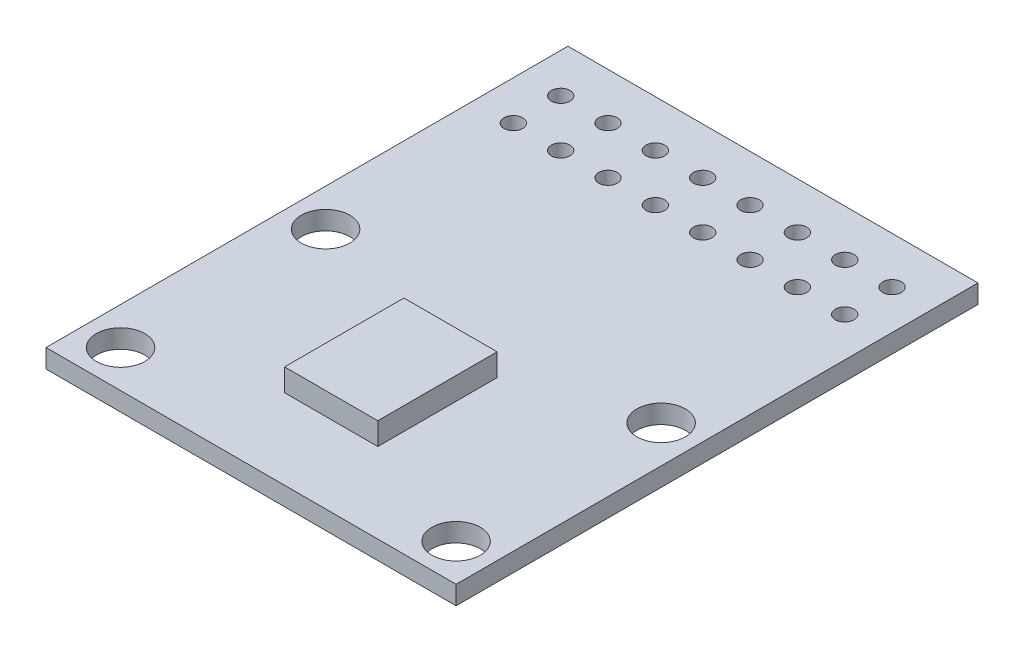
ISO-10303-21;
HEADER;
FILE_DESCRIPTION(('STEP AP214'),'2;1');
FILE_NAME('part.step','',(''),(''),'','','');
FILE_SCHEMA(('AUTOMOTIVE_DESIGN { 1 0 10303 214 1 1 1 1 }'));
ENDSEC;
DATA;
#1=APPLICATION_CONTEXT('core data for automotive mechanical design processes');
#2=APPLICATION_PROTOCOL_DEFINITION('international standard','automotive_design',2000,#1);
#3=PRODUCT_CONTEXT('',#1,'mechanical');
#4=PRODUCT('Part','Part','',(#3));
#5=PRODUCT_RELATED_PRODUCT_CATEGORY('part','',(#4));
#6=PRODUCT_DEFINITION_FORMATION('','',#4);
#7=PRODUCT_DEFINITION_CONTEXT('part definition',#1,'design');
#8=PRODUCT_DEFINITION('design','',#6,#7);
#9=PRODUCT_DEFINITION_SHAPE('','',#8);
#10=(LENGTH_UNIT() NAMED_UNIT(*) SI_UNIT(.MILLI.,.METRE.));
#11=(NAMED_UNIT(*) PLANE_ANGLE_UNIT() SI_UNIT($,.RADIAN.));
#12=(NAMED_UNIT(*) SI_UNIT($,.STERADIAN.) SOLID_ANGLE_UNIT());
#13=UNCERTAINTY_MEASURE_WITH_UNIT(LENGTH_MEASURE(1.E-05),#10,'distance_accuracy_value','');
#14=(GEOMETRIC_REPRESENTATION_CONTEXT(3) GLOBAL_UNCERTAINTY_ASSIGNED_CONTEXT((#13)) GLOBAL_UNIT_ASSIGNED_CONTEXT((#10,
#11,#12)) REPRESENTATION_CONTEXT('',''));
#15=CARTESIAN_POINT('',(0.,0.,0.));
#16=DIRECTION('',(0.,0.,1.));
#17=DIRECTION('',(1.,0.,0.));
#18=AXIS2_PLACEMENT_3D('',#15,#16,#17);
#19=CARTESIAN_POINT('',(0.,1.,0.));
#20=DIRECTION('',(0.,-1.,0.));
#21=DIRECTION('',(0.,0.,-1.));
#22=AXIS2_PLACEMENT_3D('',#19,#20,#21);
#23=PLANE('',#22);
#24=CARTESIAN_POINT('',(-8.89,1.,-18.));
#25=DIRECTION('',(0.,-1.,0.));
#26=DIRECTION('',(0.,0.,-1.));
#27=AXIS2_PLACEMENT_3D('',#24,#25,#26);
#28=CIRCLE('',#27,0.500000000000001);
#29=CARTESIAN_POINT('',(-8.89,1.,-18.5));
#30=VERTEX_POINT('',#29);
#31=EDGE_CURVE('E494',#30,#30,#28,.T.);
#32=ORIENTED_EDGE('',*,*,#31,.T.);
#33=EDGE_LOOP('',(#32));
#34=FACE_BOUND('',#33,.T.);
#35=CARTESIAN_POINT('',(8.89,1.,-18.));
#36=DIRECTION('',(0.,-1.,0.));
#37=DIRECTION('',(0.,0.,-1.));
#38=AXIS2_PLACEMENT_3D('',#35,#36,#37);
#39=CIRCLE('',#38,0.500000000000001);
#40=CARTESIAN_POINT('',(8.89,1.,-18.5));
#41=VERTEX_POINT('',#40);
#42=EDGE_CURVE('E498',#41,#41,#39,.T.);
#43=ORIENTED_EDGE('',*,*,#42,.T.);
#44=EDGE_LOOP('',(#43));
#45=FACE_BOUND('',#44,.T.);
#46=CARTESIAN_POINT('',(6.35,1.,-18.));
#47=DIRECTION('',(0.,-1.,0.));
#48=DIRECTION('',(0.,0.,-1.));
#49=AXIS2_PLACEMENT_3D('',#46,#47,#48);
#50=CIRCLE('',#49,0.500000000000001);
#51=CARTESIAN_POINT('',(6.35,1.,-18.5));
#52=VERTEX_POINT('',#51);
#53=EDGE_CURVE('E507',#52,#52,#50,.T.);
#54=ORIENTED_EDGE('',*,*,#53,.T.);
#55=EDGE_LOOP('',(#54));
#56=FACE_BOUND('',#55,.T.);
#57=CARTESIAN_POINT('',(3.81,1.,-18.));
#58=DIRECTION('',(0.,-1.,0.));
#59=DIRECTION('',(0.,0.,-1.));
#60=AXIS2_PLACEMENT_3D('',#57,#58,#59);
#61=CIRCLE('',#60,0.500000000000001);
#62=CARTESIAN_POINT('',(3.81,1.,-18.5));
#63=VERTEX_POINT('',#62);
#64=EDGE_CURVE('E513',#63,#63,#61,.T.);
#65=ORIENTED_EDGE('',*,*,#64,.T.);
#66=EDGE_LOOP('',(#65));
#67=FACE_BOUND('',#66,.T.);
#68=CARTESIAN_POINT('',(1.27,1.,-18.));
#69=DIRECTION('',(0.,-1.,0.));
#70=DIRECTION('',(0.,0.,-1.));
#71=AXIS2_PLACEMENT_3D('',#68,#69,#70);
#72=CIRCLE('',#71,0.500000000000001);
#73=CARTESIAN_POINT('',(1.27,1.,-18.5));
#74=VERTEX_POINT('',#73);
#75=EDGE_CURVE('E519',#74,#74,#72,.T.);
#76=ORIENTED_EDGE('',*,*,#75,.T.);
#77=EDGE_LOOP('',(#76));
#78=FACE_BOUND('',#77,.T.);
#79=CARTESIAN_POINT('',(-1.27,1.,-18.));
#80=DIRECTION('',(0.,-1.,0.));
#81=DIRECTION('',(0.,0.,-1.));
#82=AXIS2_PLACEMENT_3D('',#79,#80,#81);
#83=CIRCLE('',#82,0.500000000000001);
#84=CARTESIAN_POINT('',(-1.27,1.,-18.5));
#85=VERTEX_POINT('',#84);
#86=EDGE_CURVE('E525',#85,#85,#83,.T.);
#87=ORIENTED_EDGE('',*,*,#86,.T.);
#88=EDGE_LOOP('',(#87));
#89=FACE_BOUND('',#88,.T.);
#90=CARTESIAN_POINT('',(-3.81,1.,-18.));
#91=DIRECTION('',(0.,-1.,0.));
#92=DIRECTION('',(0.,0.,-1.));
#93=AXIS2_PLACEMENT_3D('',#90,#91,#92);
#94=CIRCLE('',#93,0.500000000000002);
#95=CARTESIAN_POINT('',(-3.81,1.,-18.5));
#96=VERTEX_POINT('',#95);
#97=EDGE_CURVE('E531',#96,#96,#94,.T.);
#98=ORIENTED_EDGE('',*,*,#97,.T.);
#99=EDGE_LOOP('',(#98));
#100=FACE_BOUND('',#99,.T.);
#101=CARTESIAN_POINT('',(-6.35,1.,-18.));
#102=DIRECTION('',(0.,-1.,0.));
#103=DIRECTION('',(0.,0.,-1.));
#104=AXIS2_PLACEMENT_3D('',#101,#102,#103);
#105=CIRCLE('',#104,0.500000000000001);
#106=CARTESIAN_POINT('',(-6.35,1.,-18.5));
#107=VERTEX_POINT('',#106);
#108=EDGE_CURVE('E537',#107,#107,#105,.T.);
#109=ORIENTED_EDGE('',*,*,#108,.T.);
#110=EDGE_LOOP('',(#109));
#111=FACE_BOUND('',#110,.T.);
#112=CARTESIAN_POINT('',(8.89000000000001,1.,-15.46));
#113=DIRECTION('',(0.,-1.,0.));
#114=DIRECTION('',(0.,0.,-1.));
#115=AXIS2_PLACEMENT_3D('',#112,#113,#114);
#116=CIRCLE('',#115,0.500000000000001);
#117=CARTESIAN_POINT('',(8.89000000000001,1.,-15.96));
#118=VERTEX_POINT('',#117);
#119=EDGE_CURVE('E543',#118,#118,#116,.T.);
#120=ORIENTED_EDGE('',*,*,#119,.T.);
#121=EDGE_LOOP('',(#120));
#122=FACE_BOUND('',#121,.T.);
#123=CARTESIAN_POINT('',(6.35000000000001,1.,-15.46));
#124=DIRECTION('',(0.,-1.,0.));
#125=DIRECTION('',(0.,0.,-1.));
#126=AXIS2_PLACEMENT_3D('',#123,#124,#125);
#127=CIRCLE('',#126,0.500000000000001);
#128=CARTESIAN_POINT('',(6.35000000000001,1.,-15.96));
#129=VERTEX_POINT('',#128);
#130=EDGE_CURVE('E549',#129,#129,#127,.T.);
#131=ORIENTED_EDGE('',*,*,#130,.T.);
#132=EDGE_LOOP('',(#131));
#133=FACE_BOUND('',#132,.T.);
#134=CARTESIAN_POINT('',(3.81000000000001,1.,-15.46));
#135=DIRECTION('',(0.,-1.,0.));
#136=DIRECTION('',(0.,0.,-1.));
#137=AXIS2_PLACEMENT_3D('',#134,#135,#136);
#138=CIRCLE('',#137,0.500000000000001);
#139=CARTESIAN_POINT('',(3.81000000000001,1.,-15.96));
#140=VERTEX_POINT('',#139);
#141=EDGE_CURVE('E555',#140,#140,#138,.T.);
#142=ORIENTED_EDGE('',*,*,#141,.T.);
#143=EDGE_LOOP('',(#142));
#144=FACE_BOUND('',#143,.T.);
#145=CARTESIAN_POINT('',(1.27000000000001,1.,-15.46));
#146=DIRECTION('',(0.,-1.,0.));
#147=DIRECTION('',(0.,0.,-1.));
#148=AXIS2_PLACEMENT_3D('',#145,#146,#147);
#149=CIRCLE('',#148,0.500000000000001);
#150=CARTESIAN_POINT('',(1.27000000000001,1.,-15.96));
#151=VERTEX_POINT('',#150);
#152=EDGE_CURVE('E561',#151,#151,#149,.T.);
#153=ORIENTED_EDGE('',*,*,#152,.T.);
#154=EDGE_LOOP('',(#153));
#155=FACE_BOUND('',#154,.T.);
#156=CARTESIAN_POINT('',(-1.26999999999999,1.,-15.46));
#157=DIRECTION('',(0.,-1.,0.));
#158=DIRECTION('',(0.,0.,-1.));
#159=AXIS2_PLACEMENT_3D('',#156,#157,#158);
#160=CIRCLE('',#159,0.500000000000001);
#161=CARTESIAN_POINT('',(-1.26999999999999,1.,-15.96));
#162=VERTEX_POINT('',#161);
#163=EDGE_CURVE('E567',#162,#162,#160,.T.);
#164=ORIENTED_EDGE('',*,*,#163,.T.);
#165=EDGE_LOOP('',(#164));
#166=FACE_BOUND('',#165,.T.);
#167=CARTESIAN_POINT('',(-3.80999999999999,1.,-15.46));
#168=DIRECTION('',(0.,-1.,0.));
#169=DIRECTION('',(0.,0.,-1.));
#170=AXIS2_PLACEMENT_3D('',#167,#168,#169);
#171=CIRCLE('',#170,0.500000000000002);
#172=CARTESIAN_POINT('',(-3.80999999999999,1.,-15.96));
#173=VERTEX_POINT('',#172);
#174=EDGE_CURVE('E573',#173,#173,#171,.T.);
#175=ORIENTED_EDGE('',*,*,#174,.T.);
#176=EDGE_LOOP('',(#175));
#177=FACE_BOUND('',#176,.T.);
#178=CARTESIAN_POINT('',(-6.34999999999999,1.,-15.46));
#179=DIRECTION('',(0.,-1.,0.));
#180=DIRECTION('',(0.,0.,-1.));
#181=AXIS2_PLACEMENT_3D('',#178,#179,#180);
#182=CIRCLE('',#181,0.500000000000001);
#183=CARTESIAN_POINT('',(-6.34999999999999,1.,-15.96));
#184=VERTEX_POINT('',#183);
#185=EDGE_CURVE('E579',#184,#184,#182,.T.);
#186=ORIENTED_EDGE('',*,*,#185,.T.);
#187=EDGE_LOOP('',(#186));
#188=FACE_BOUND('',#187,.T.);
#189=CARTESIAN_POINT('',(-8.88999999999999,1.,-15.46));
#190=DIRECTION('',(0.,-1.,0.));
#191=DIRECTION('',(0.,0.,-1.));
#192=AXIS2_PLACEMENT_3D('',#189,#190,#191);
#193=CIRCLE('',#192,0.500000000000001);
#194=CARTESIAN_POINT('',(-8.88999999999999,1.,-15.96));
#195=VERTEX_POINT('',#194);
#196=EDGE_CURVE('E585',#195,#195,#193,.T.);
#197=ORIENTED_EDGE('',*,*,#196,.T.);
#198=EDGE_LOOP('',(#197));
#199=FACE_BOUND('',#198,.T.);
#200=DIRECTION('',(0.,0.,-1.));
#201=VECTOR('',#200,1.);
#202=CARTESIAN_POINT('',(11.,1.,-20.5));
#203=LINE('',#202,#201);
#204=CARTESIAN_POINT('',(11.,1.,7.5));
#205=VERTEX_POINT('',#204);
#206=CARTESIAN_POINT('',(11.,1.,-20.5));
#207=VERTEX_POINT('',#206);
#208=EDGE_CURVE('E151',#205,#207,#203,.T.);
#209=ORIENTED_EDGE('',*,*,#208,.T.);
#210=DIRECTION('',(-1.,0.,0.));
#211=VECTOR('',#210,1.);
#212=CARTESIAN_POINT('',(11.,1.,-20.5));
#213=LINE('',#212,#211);
#214=CARTESIAN_POINT('',(-11.,1.,-20.5));
#215=VERTEX_POINT('',#214);
#216=EDGE_CURVE('E154',#207,#215,#213,.T.);
#217=ORIENTED_EDGE('',*,*,#216,.T.);
#218=DIRECTION('',(0.,0.,1.));
#219=VECTOR('',#218,1.);
#220=CARTESIAN_POINT('',(-11.,1.,-20.5));
#221=LINE('',#220,#219);
#222=CARTESIAN_POINT('',(-11.,1.,7.5));
#223=VERTEX_POINT('',#222);
#224=EDGE_CURVE('E157',#215,#223,#221,.T.);
#225=ORIENTED_EDGE('',*,*,#224,.T.);
#226=DIRECTION('',(1.,0.,0.));
#227=VECTOR('',#226,1.);
#228=CARTESIAN_POINT('',(11.,1.,7.5));
#229=LINE('',#228,#227);
#230=EDGE_CURVE('E159',#223,#205,#229,.T.);
#231=ORIENTED_EDGE('',*,*,#230,.T.);
#232=EDGE_LOOP('',(#209,#217,#225,#231));
#233=FACE_BOUND('',#232,.T.);
#234=CARTESIAN_POINT('',(-9.,1.,5.5));
#235=DIRECTION('',(0.,1.,0.));
#236=DIRECTION('',(0.,0.,1.));
#237=AXIS2_PLACEMENT_3D('',#234,#235,#236);
#238=CIRCLE('',#237,1.3);
#239=CARTESIAN_POINT('',(-9.,1.,6.8));
#240=VERTEX_POINT('',#239);
#241=EDGE_CURVE('E142',#240,#240,#238,.T.);
#242=ORIENTED_EDGE('',*,*,#241,.F.);
#243=EDGE_LOOP('',(#242));
#244=FACE_BOUND('',#243,.T.);
#245=CARTESIAN_POINT('',(9.,1.,5.5));
#246=DIRECTION('',(0.,1.,0.));
#247=DIRECTION('',(0.,0.,1.));
#248=AXIS2_PLACEMENT_3D('',#245,#246,#247);
#249=CIRCLE('',#248,1.3);
#250=CARTESIAN_POINT('',(9.,1.,6.8));
#251=VERTEX_POINT('',#250);
#252=EDGE_CURVE('E136',#251,#251,#249,.T.);
#253=ORIENTED_EDGE('',*,*,#252,.F.);
#254=EDGE_LOOP('',(#253));
#255=FACE_BOUND('',#254,.T.);
#256=CARTESIAN_POINT('',(8.99999999999996,1.,-5.5));
#257=DIRECTION('',(0.,1.,0.));
#258=DIRECTION('',(0.,0.,1.));
#259=AXIS2_PLACEMENT_3D('',#256,#257,#258);
#260=CIRCLE('',#259,1.3);
#261=CARTESIAN_POINT('',(8.99999999999996,1.,-4.2));
#262=VERTEX_POINT('',#261);
#263=EDGE_CURVE('E131',#262,#262,#260,.T.);
#264=ORIENTED_EDGE('',*,*,#263,.F.);
#265=EDGE_LOOP('',(#264));
#266=FACE_BOUND('',#265,.T.);
#267=CARTESIAN_POINT('',(-9.00000000000004,1.,-5.5));
#268=DIRECTION('',(0.,1.,0.));
#269=DIRECTION('',(0.,0.,1.));
#270=AXIS2_PLACEMENT_3D('',#267,#268,#269);
#271=CIRCLE('',#270,1.3);
#272=CARTESIAN_POINT('',(-9.00000000000004,1.,-4.2));
#273=VERTEX_POINT('',#272);
#274=EDGE_CURVE('E121',#273,#273,#271,.T.);
#275=ORIENTED_EDGE('',*,*,#274,.F.);
#276=EDGE_LOOP('',(#275));
#277=FACE_BOUND('',#276,.T.);
#278=DIRECTION('',(0.,0.,-1.));
#279=VECTOR('',#278,1.);
#280=CARTESIAN_POINT('',(2.5,1.,-3.2));
#281=LINE('',#280,#279);
#282=CARTESIAN_POINT('',(2.5,1.,3.2));
#283=VERTEX_POINT('',#282);
#284=CARTESIAN_POINT('',(2.5,1.,-3.2));
#285=VERTEX_POINT('',#284);
#286=EDGE_CURVE('E120',#283,#285,#281,.T.);
#287=ORIENTED_EDGE('',*,*,#286,.F.);
#288=DIRECTION('',(1.,0.,0.));
#289=VECTOR('',#288,1.);
#290=CARTESIAN_POINT('',(-2.5,1.,3.2));
#291=LINE('',#290,#289);
#292=CARTESIAN_POINT('',(-2.5,1.,3.2));
#293=VERTEX_POINT('',#292);
#294=EDGE_CURVE('E117',#293,#283,#291,.T.);
#295=ORIENTED_EDGE('',*,*,#294,.F.);
#296=DIRECTION('',(0.,0.,1.));
#297=VECTOR('',#296,1.);
#298=CARTESIAN_POINT('',(-2.5,1.,-3.2));
#299=LINE('',#298,#297);
#300=CARTESIAN_POINT('',(-2.5,1.,-3.2));
#301=VERTEX_POINT('',#300);
#302=EDGE_CURVE('E55',#301,#293,#299,.T.);
#303=ORIENTED_EDGE('',*,*,#302,.F.);
#304=DIRECTION('',(-1.,0.,0.));
#305=VECTOR('',#304,1.);
#306=CARTESIAN_POINT('',(-2.5,1.,-3.2));
#307=LINE('',#306,#305);
#308=EDGE_CURVE('E50',#285,#301,#307,.T.);
#309=ORIENTED_EDGE('',*,*,#308,.F.);
#310=EDGE_LOOP('',(#287,#295,#303,#309));
#311=FACE_BOUND('',#310,.T.);
#312=ADVANCED_FACE('F35',(#34,#45,#56,#67,#78,#89,#100,#111,#122,#133,#144,#155,#166,#177,#188,
#199,#233,#244,#255,#266,#277,#311),#23,.F.);
#313=CARTESIAN_POINT('',(11.,1.,-20.5));
#314=DIRECTION('',(-1.,0.,0.));
#315=DIRECTION('',(0.,0.,1.));
#316=AXIS2_PLACEMENT_3D('',#313,#314,#315);
#317=PLANE('',#316);
#318=DIRECTION('',(0.,0.,-1.));
#319=VECTOR('',#318,1.);
#320=CARTESIAN_POINT('',(11.,0.,-20.5));
#321=LINE('',#320,#319);
#322=CARTESIAN_POINT('',(11.,0.,7.5));
#323=VERTEX_POINT('',#322);
#324=CARTESIAN_POINT('',(11.,0.,-20.5));
#325=VERTEX_POINT('',#324);
#326=EDGE_CURVE('E148',#323,#325,#321,.T.);
#327=ORIENTED_EDGE('',*,*,#326,.T.);
#328=DIRECTION('',(0.,-1.,0.));
#329=VECTOR('',#328,1.);
#330=CARTESIAN_POINT('',(11.,1.,-20.5));
#331=LINE('',#330,#329);
#332=EDGE_CURVE('E11',#207,#325,#331,.T.);
#333=ORIENTED_EDGE('',*,*,#332,.F.);
#334=ORIENTED_EDGE('',*,*,#208,.F.);
#335=DIRECTION('',(0.,-1.,0.));
#336=VECTOR('',#335,1.);
#337=CARTESIAN_POINT('',(11.,1.,7.5));
#338=LINE('',#337,#336);
#339=EDGE_CURVE('E161',#205,#323,#338,.T.);
#340=ORIENTED_EDGE('',*,*,#339,.T.);
#341=EDGE_LOOP('',(#327,#333,#334,#340));
#342=FACE_BOUND('',#341,.T.);
#343=ADVANCED_FACE('F37',(#342),#317,.F.);
#344=CARTESIAN_POINT('',(11.,1.,-20.5));
#345=DIRECTION('',(0.,0.,1.));
#346=DIRECTION('',(1.,0.,0.));
#347=AXIS2_PLACEMENT_3D('',#344,#345,#346);
#348=PLANE('',#347);
#349=DIRECTION('',(-1.,0.,0.));
#350=VECTOR('',#349,1.);
#351=CARTESIAN_POINT('',(11.,0.,-20.5));
#352=LINE('',#351,#350);
#353=CARTESIAN_POINT('',(-11.,0.,-20.5));
#354=VERTEX_POINT('',#353);
#355=EDGE_CURVE('E164',#325,#354,#352,.T.);
#356=ORIENTED_EDGE('',*,*,#355,.T.);
#357=DIRECTION('',(0.,-1.,0.));
#358=VECTOR('',#357,1.);
#359=CARTESIAN_POINT('',(-11.,1.,-20.5));
#360=LINE('',#359,#358);
#361=EDGE_CURVE('E43',#215,#354,#360,.T.);
#362=ORIENTED_EDGE('',*,*,#361,.F.);
#363=ORIENTED_EDGE('',*,*,#216,.F.);
#364=ORIENTED_EDGE('',*,*,#332,.T.);
#365=EDGE_LOOP('',(#356,#362,#363,#364));
#366=FACE_BOUND('',#365,.T.);
#367=ADVANCED_FACE('F194',(#366),#348,.F.);
#368=CARTESIAN_POINT('',(-11.,1.,-20.5));
#369=DIRECTION('',(1.,0.,0.));
#370=DIRECTION('',(0.,0.,-1.));
#371=AXIS2_PLACEMENT_3D('',#368,#369,#370);
#372=PLANE('',#371);
#373=DIRECTION('',(0.,0.,1.));
#374=VECTOR('',#373,1.);
#375=CARTESIAN_POINT('',(-11.,0.,-20.5));
#376=LINE('',#375,#374);
#377=CARTESIAN_POINT('',(-11.,0.,7.5));
#378=VERTEX_POINT('',#377);
#379=EDGE_CURVE('E166',#354,#378,#376,.T.);
#380=ORIENTED_EDGE('',*,*,#379,.T.);
#381=DIRECTION('',(0.,-1.,0.));
#382=VECTOR('',#381,1.);
#383=CARTESIAN_POINT('',(-11.,1.,7.5));
#384=LINE('',#383,#382);
#385=EDGE_CURVE('E171',#223,#378,#384,.T.);
#386=ORIENTED_EDGE('',*,*,#385,.F.);
#387=ORIENTED_EDGE('',*,*,#224,.F.);
#388=ORIENTED_EDGE('',*,*,#361,.T.);
#389=EDGE_LOOP('',(#380,#386,#387,#388));
#390=FACE_BOUND('',#389,.T.);
#391=ADVANCED_FACE('F178',(#390),#372,.F.);
#392=CARTESIAN_POINT('',(11.,1.,7.5));
#393=DIRECTION('',(0.,0.,-1.));
#394=DIRECTION('',(-1.,0.,0.));
#395=AXIS2_PLACEMENT_3D('',#392,#393,#394);
#396=PLANE('',#395);
#397=DIRECTION('',(1.,0.,0.));
#398=VECTOR('',#397,1.);
#399=CARTESIAN_POINT('',(11.,0.,7.5));
#400=LINE('',#399,#398);
#401=EDGE_CURVE('E155',#378,#323,#400,.T.);
#402=ORIENTED_EDGE('',*,*,#401,.T.);
#403=ORIENTED_EDGE('',*,*,#339,.F.);
#404=ORIENTED_EDGE('',*,*,#230,.F.);
#405=ORIENTED_EDGE('',*,*,#385,.T.);
#406=EDGE_LOOP('',(#402,#403,#404,#405));
#407=FACE_BOUND('',#406,.T.);
#408=ADVANCED_FACE('F187',(#407),#396,.F.);
#409=CARTESIAN_POINT('',(0.,0.,0.));
#410=DIRECTION('',(0.,-1.,0.));
#411=DIRECTION('',(0.,0.,-1.));
#412=AXIS2_PLACEMENT_3D('',#409,#410,#411);
#413=PLANE('',#412);
#414=CARTESIAN_POINT('',(-8.89,0.,-18.));
#415=DIRECTION('',(0.,1.,0.));
#416=DIRECTION('',(0.,0.,1.));
#417=AXIS2_PLACEMENT_3D('',#414,#415,#416);
#418=CIRCLE('',#417,0.500000000000001);
#419=CARTESIAN_POINT('',(-8.89,0.,-17.5));
#420=VERTEX_POINT('',#419);
#421=EDGE_CURVE('E492',#420,#420,#418,.T.);
#422=ORIENTED_EDGE('',*,*,#421,.T.);
#423=EDGE_LOOP('',(#422));
#424=FACE_BOUND('',#423,.T.);
#425=CARTESIAN_POINT('',(8.89,0.,-18.));
#426=DIRECTION('',(0.,1.,0.));
#427=DIRECTION('',(0.,0.,1.));
#428=AXIS2_PLACEMENT_3D('',#425,#426,#427);
#429=CIRCLE('',#428,0.500000000000001);
#430=CARTESIAN_POINT('',(8.89,0.,-17.5));
#431=VERTEX_POINT('',#430);
#432=EDGE_CURVE('E495',#431,#431,#429,.T.);
#433=ORIENTED_EDGE('',*,*,#432,.T.);
#434=EDGE_LOOP('',(#433));
#435=FACE_BOUND('',#434,.T.);
#436=CARTESIAN_POINT('',(6.35,0.,-18.));
#437=DIRECTION('',(0.,1.,0.));
#438=DIRECTION('',(0.,0.,1.));
#439=AXIS2_PLACEMENT_3D('',#436,#437,#438);
#440=CIRCLE('',#439,0.500000000000001);
#441=CARTESIAN_POINT('',(6.35,0.,-17.5));
#442=VERTEX_POINT('',#441);
#443=EDGE_CURVE('E504',#442,#442,#440,.T.);
#444=ORIENTED_EDGE('',*,*,#443,.T.);
#445=EDGE_LOOP('',(#444));
#446=FACE_BOUND('',#445,.T.);
#447=CARTESIAN_POINT('',(3.81,0.,-18.));
#448=DIRECTION('',(0.,1.,0.));
#449=DIRECTION('',(0.,0.,1.));
#450=AXIS2_PLACEMENT_3D('',#447,#448,#449);
#451=CIRCLE('',#450,0.500000000000001);
#452=CARTESIAN_POINT('',(3.81,0.,-17.5));
#453=VERTEX_POINT('',#452);
#454=EDGE_CURVE('E510',#453,#453,#451,.T.);
#455=ORIENTED_EDGE('',*,*,#454,.T.);
#456=EDGE_LOOP('',(#455));
#457=FACE_BOUND('',#456,.T.);
#458=CARTESIAN_POINT('',(1.27,0.,-18.));
#459=DIRECTION('',(0.,1.,0.));
#460=DIRECTION('',(0.,0.,1.));
#461=AXIS2_PLACEMENT_3D('',#458,#459,#460);
#462=CIRCLE('',#461,0.500000000000001);
#463=CARTESIAN_POINT('',(1.27,0.,-17.5));
#464=VERTEX_POINT('',#463);
#465=EDGE_CURVE('E516',#464,#464,#462,.T.);
#466=ORIENTED_EDGE('',*,*,#465,.T.);
#467=EDGE_LOOP('',(#466));
#468=FACE_BOUND('',#467,.T.);
#469=CARTESIAN_POINT('',(-1.27,0.,-18.));
#470=DIRECTION('',(0.,1.,0.));
#471=DIRECTION('',(0.,0.,1.));
#472=AXIS2_PLACEMENT_3D('',#469,#470,#471);
#473=CIRCLE('',#472,0.500000000000001);
#474=CARTESIAN_POINT('',(-1.27,0.,-17.5));
#475=VERTEX_POINT('',#474);
#476=EDGE_CURVE('E522',#475,#475,#473,.T.);
#477=ORIENTED_EDGE('',*,*,#476,.T.);
#478=EDGE_LOOP('',(#477));
#479=FACE_BOUND('',#478,.T.);
#480=CARTESIAN_POINT('',(-3.81,0.,-18.));
#481=DIRECTION('',(0.,1.,0.));
#482=DIRECTION('',(0.,0.,1.));
#483=AXIS2_PLACEMENT_3D('',#480,#481,#482);
#484=CIRCLE('',#483,0.500000000000002);
#485=CARTESIAN_POINT('',(-3.81,0.,-17.5));
#486=VERTEX_POINT('',#485);
#487=EDGE_CURVE('E528',#486,#486,#484,.T.);
#488=ORIENTED_EDGE('',*,*,#487,.T.);
#489=EDGE_LOOP('',(#488));
#490=FACE_BOUND('',#489,.T.);
#491=CARTESIAN_POINT('',(-6.35,0.,-18.));
#492=DIRECTION('',(0.,1.,0.));
#493=DIRECTION('',(0.,0.,1.));
#494=AXIS2_PLACEMENT_3D('',#491,#492,#493);
#495=CIRCLE('',#494,0.500000000000001);
#496=CARTESIAN_POINT('',(-6.35,0.,-17.5));
#497=VERTEX_POINT('',#496);
#498=EDGE_CURVE('E534',#497,#497,#495,.T.);
#499=ORIENTED_EDGE('',*,*,#498,.T.);
#500=EDGE_LOOP('',(#499));
#501=FACE_BOUND('',#500,.T.);
#502=CARTESIAN_POINT('',(8.89000000000001,0.,-15.46));
#503=DIRECTION('',(0.,1.,0.));
#504=DIRECTION('',(0.,0.,1.));
#505=AXIS2_PLACEMENT_3D('',#502,#503,#504);
#506=CIRCLE('',#505,0.500000000000001);
#507=CARTESIAN_POINT('',(8.89000000000001,0.,-14.96));
#508=VERTEX_POINT('',#507);
#509=EDGE_CURVE('E540',#508,#508,#506,.T.);
#510=ORIENTED_EDGE('',*,*,#509,.T.);
#511=EDGE_LOOP('',(#510));
#512=FACE_BOUND('',#511,.T.);
#513=CARTESIAN_POINT('',(6.35000000000001,0.,-15.46));
#514=DIRECTION('',(0.,1.,0.));
#515=DIRECTION('',(0.,0.,1.));
#516=AXIS2_PLACEMENT_3D('',#513,#514,#515);
#517=CIRCLE('',#516,0.500000000000001);
#518=CARTESIAN_POINT('',(6.35000000000001,0.,-14.96));
#519=VERTEX_POINT('',#518);
#520=EDGE_CURVE('E546',#519,#519,#517,.T.);
#521=ORIENTED_EDGE('',*,*,#520,.T.);
#522=EDGE_LOOP('',(#521));
#523=FACE_BOUND('',#522,.T.);
#524=CARTESIAN_POINT('',(3.81000000000001,0.,-15.46));
#525=DIRECTION('',(0.,1.,0.));
#526=DIRECTION('',(0.,0.,1.));
#527=AXIS2_PLACEMENT_3D('',#524,#525,#526);
#528=CIRCLE('',#527,0.500000000000001);
#529=CARTESIAN_POINT('',(3.81000000000001,0.,-14.96));
#530=VERTEX_POINT('',#529);
#531=EDGE_CURVE('E552',#530,#530,#528,.T.);
#532=ORIENTED_EDGE('',*,*,#531,.T.);
#533=EDGE_LOOP('',(#532));
#534=FACE_BOUND('',#533,.T.);
#535=CARTESIAN_POINT('',(1.27000000000001,0.,-15.46));
#536=DIRECTION('',(0.,1.,0.));
#537=DIRECTION('',(0.,0.,1.));
#538=AXIS2_PLACEMENT_3D('',#535,#536,#537);
#539=CIRCLE('',#538,0.500000000000001);
#540=CARTESIAN_POINT('',(1.27000000000001,0.,-14.96));
#541=VERTEX_POINT('',#540);
#542=EDGE_CURVE('E558',#541,#541,#539,.T.);
#543=ORIENTED_EDGE('',*,*,#542,.T.);
#544=EDGE_LOOP('',(#543));
#545=FACE_BOUND('',#544,.T.);
#546=CARTESIAN_POINT('',(-1.26999999999999,0.,-15.46));
#547=DIRECTION('',(0.,1.,0.));
#548=DIRECTION('',(0.,0.,1.));
#549=AXIS2_PLACEMENT_3D('',#546,#547,#548);
#550=CIRCLE('',#549,0.500000000000001);
#551=CARTESIAN_POINT('',(-1.26999999999999,0.,-14.96));
#552=VERTEX_POINT('',#551);
#553=EDGE_CURVE('E564',#552,#552,#550,.T.);
#554=ORIENTED_EDGE('',*,*,#553,.T.);
#555=EDGE_LOOP('',(#554));
#556=FACE_BOUND('',#555,.T.);
#557=CARTESIAN_POINT('',(-3.80999999999999,0.,-15.46));
#558=DIRECTION('',(0.,1.,0.));
#559=DIRECTION('',(0.,0.,1.));
#560=AXIS2_PLACEMENT_3D('',#557,#558,#559);
#561=CIRCLE('',#560,0.500000000000002);
#562=CARTESIAN_POINT('',(-3.80999999999999,0.,-14.96));
#563=VERTEX_POINT('',#562);
#564=EDGE_CURVE('E570',#563,#563,#561,.T.);
#565=ORIENTED_EDGE('',*,*,#564,.T.);
#566=EDGE_LOOP('',(#565));
#567=FACE_BOUND('',#566,.T.);
#568=CARTESIAN_POINT('',(-6.34999999999999,0.,-15.46));
#569=DIRECTION('',(0.,1.,0.));
#570=DIRECTION('',(0.,0.,1.));
#571=AXIS2_PLACEMENT_3D('',#568,#569,#570);
#572=CIRCLE('',#571,0.500000000000001);
#573=CARTESIAN_POINT('',(-6.34999999999999,0.,-14.96));
#574=VERTEX_POINT('',#573);
#575=EDGE_CURVE('E576',#574,#574,#572,.T.);
#576=ORIENTED_EDGE('',*,*,#575,.T.);
#577=EDGE_LOOP('',(#576));
#578=FACE_BOUND('',#577,.T.);
#579=CARTESIAN_POINT('',(-8.88999999999999,0.,-15.46));
#580=DIRECTION('',(0.,1.,0.));
#581=DIRECTION('',(0.,0.,1.));
#582=AXIS2_PLACEMENT_3D('',#579,#580,#581);
#583=CIRCLE('',#582,0.500000000000001);
#584=CARTESIAN_POINT('',(-8.88999999999999,0.,-14.96));
#585=VERTEX_POINT('',#584);
#586=EDGE_CURVE('E582',#585,#585,#583,.T.);
#587=ORIENTED_EDGE('',*,*,#586,.T.);
#588=EDGE_LOOP('',(#587));
#589=FACE_BOUND('',#588,.T.);
#590=CARTESIAN_POINT('',(-9.00000000000004,0.,-5.5));
#591=DIRECTION('',(0.,1.,0.));
#592=DIRECTION('',(0.,0.,1.));
#593=AXIS2_PLACEMENT_3D('',#590,#591,#592);
#594=CIRCLE('',#593,1.3);
#595=CARTESIAN_POINT('',(-9.00000000000004,0.,-4.2));
#596=VERTEX_POINT('',#595);
#597=EDGE_CURVE('E124',#596,#596,#594,.T.);
#598=ORIENTED_EDGE('',*,*,#597,.T.);
#599=EDGE_LOOP('',(#598));
#600=FACE_BOUND('',#599,.T.);
#601=CARTESIAN_POINT('',(8.99999999999996,0.,-5.5));
#602=DIRECTION('',(0.,1.,0.));
#603=DIRECTION('',(0.,0.,1.));
#604=AXIS2_PLACEMENT_3D('',#601,#602,#603);
#605=CIRCLE('',#604,1.3);
#606=CARTESIAN_POINT('',(8.99999999999996,0.,-4.2));
#607=VERTEX_POINT('',#606);
#608=EDGE_CURVE('E133',#607,#607,#605,.T.);
#609=ORIENTED_EDGE('',*,*,#608,.T.);
#610=EDGE_LOOP('',(#609));
#611=FACE_BOUND('',#610,.T.);
#612=CARTESIAN_POINT('',(9.,0.,5.5));
#613=DIRECTION('',(0.,1.,0.));
#614=DIRECTION('',(0.,0.,1.));
#615=AXIS2_PLACEMENT_3D('',#612,#613,#614);
#616=CIRCLE('',#615,1.3);
#617=CARTESIAN_POINT('',(9.,0.,6.8));
#618=VERTEX_POINT('',#617);
#619=EDGE_CURVE('E139',#618,#618,#616,.T.);
#620=ORIENTED_EDGE('',*,*,#619,.T.);
#621=EDGE_LOOP('',(#620));
#622=FACE_BOUND('',#621,.T.);
#623=CARTESIAN_POINT('',(-9.,0.,5.5));
#624=DIRECTION('',(0.,1.,0.));
#625=DIRECTION('',(0.,0.,1.));
#626=AXIS2_PLACEMENT_3D('',#623,#624,#625);
#627=CIRCLE('',#626,1.3);
#628=CARTESIAN_POINT('',(-9.,0.,6.8));
#629=VERTEX_POINT('',#628);
#630=EDGE_CURVE('E145',#629,#629,#627,.T.);
#631=ORIENTED_EDGE('',*,*,#630,.T.);
#632=EDGE_LOOP('',(#631));
#633=FACE_BOUND('',#632,.T.);
#634=ORIENTED_EDGE('',*,*,#326,.F.);
#635=ORIENTED_EDGE('',*,*,#401,.F.);
#636=ORIENTED_EDGE('',*,*,#379,.F.);
#637=ORIENTED_EDGE('',*,*,#355,.F.);
#638=EDGE_LOOP('',(#634,#635,#636,#637));
#639=FACE_BOUND('',#638,.T.);
#640=ADVANCED_FACE('F184',(#424,#435,#446,#457,#468,#479,#490,#501,#512,#523,#534,#545,#556,
#567,#578,#589,#600,#611,#622,#633,#639),#413,.T.);
#641=CARTESIAN_POINT('',(-9.,0.,5.5));
#642=DIRECTION('',(0.,1.,0.));
#643=DIRECTION('',(0.,0.,1.));
#644=AXIS2_PLACEMENT_3D('',#641,#642,#643);
#645=CYLINDRICAL_SURFACE('',#644,1.3);
#646=ORIENTED_EDGE('',*,*,#630,.F.);
#647=EDGE_LOOP('',(#646));
#648=FACE_BOUND('',#647,.T.);
#649=ORIENTED_EDGE('',*,*,#241,.T.);
#650=EDGE_LOOP('',(#649));
#651=FACE_BOUND('',#650,.T.);
#652=ADVANCED_FACE('F212',(#648,#651),#645,.F.);
#653=CARTESIAN_POINT('',(9.,0.,5.5));
#654=DIRECTION('',(0.,1.,0.));
#655=DIRECTION('',(0.,0.,1.));
#656=AXIS2_PLACEMENT_3D('',#653,#654,#655);
#657=CYLINDRICAL_SURFACE('',#656,1.3);
#658=ORIENTED_EDGE('',*,*,#619,.F.);
#659=EDGE_LOOP('',(#658));
#660=FACE_BOUND('',#659,.T.);
#661=ORIENTED_EDGE('',*,*,#252,.T.);
#662=EDGE_LOOP('',(#661));
#663=FACE_BOUND('',#662,.T.);
#664=ADVANCED_FACE('F235',(#660,#663),#657,.F.);
#665=CARTESIAN_POINT('',(8.99999999999996,0.,-5.5));
#666=DIRECTION('',(0.,1.,0.));
#667=DIRECTION('',(0.,0.,1.));
#668=AXIS2_PLACEMENT_3D('',#665,#666,#667);
#669=CYLINDRICAL_SURFACE('',#668,1.3);
#670=ORIENTED_EDGE('',*,*,#608,.F.);
#671=EDGE_LOOP('',(#670));
#672=FACE_BOUND('',#671,.T.);
#673=ORIENTED_EDGE('',*,*,#263,.T.);
#674=EDGE_LOOP('',(#673));
#675=FACE_BOUND('',#674,.T.);
#676=ADVANCED_FACE('F241',(#672,#675),#669,.F.);
#677=CARTESIAN_POINT('',(-9.00000000000004,0.,-5.5));
#678=DIRECTION('',(0.,1.,0.));
#679=DIRECTION('',(0.,0.,1.));
#680=AXIS2_PLACEMENT_3D('',#677,#678,#679);
#681=CYLINDRICAL_SURFACE('',#680,1.3);
#682=ORIENTED_EDGE('',*,*,#597,.F.);
#683=EDGE_LOOP('',(#682));
#684=FACE_BOUND('',#683,.T.);
#685=ORIENTED_EDGE('',*,*,#274,.T.);
#686=EDGE_LOOP('',(#685));
#687=FACE_BOUND('',#686,.T.);
#688=ADVANCED_FACE('F248',(#684,#687),#681,.F.);
#689=CARTESIAN_POINT('',(2.5,2.2,-3.2));
#690=DIRECTION('',(-1.,0.,0.));
#691=DIRECTION('',(0.,0.,1.));
#692=AXIS2_PLACEMENT_3D('',#689,#690,#691);
#693=PLANE('',#692);
#694=ORIENTED_EDGE('',*,*,#286,.T.);
#695=DIRECTION('',(0.,-1.,0.));
#696=VECTOR('',#695,1.);
#697=CARTESIAN_POINT('',(2.5,2.2,-3.2));
#698=LINE('',#697,#696);
#699=CARTESIAN_POINT('',(2.5,2.2,-3.2));
#700=VERTEX_POINT('',#699);
#701=EDGE_CURVE('E101',#700,#285,#698,.T.);
#702=ORIENTED_EDGE('',*,*,#701,.F.);
#703=DIRECTION('',(0.,0.,-1.));
#704=VECTOR('',#703,1.);
#705=CARTESIAN_POINT('',(2.5,2.2,-3.2));
#706=LINE('',#705,#704);
#707=CARTESIAN_POINT('',(2.5,2.2,3.2));
#708=VERTEX_POINT('',#707);
#709=EDGE_CURVE('E108',#708,#700,#706,.T.);
#710=ORIENTED_EDGE('',*,*,#709,.F.);
#711=DIRECTION('',(0.,-1.,0.));
#712=VECTOR('',#711,1.);
#713=CARTESIAN_POINT('',(2.5,2.2,3.2));
#714=LINE('',#713,#712);
#715=EDGE_CURVE('E590',#708,#283,#714,.T.);
#716=ORIENTED_EDGE('',*,*,#715,.T.);
#717=EDGE_LOOP('',(#694,#702,#710,#716));
#718=FACE_BOUND('',#717,.T.);
#719=ADVANCED_FACE('F119',(#718),#693,.F.);
#720=CARTESIAN_POINT('',(-2.5,2.2,-3.2));
#721=DIRECTION('',(0.,0.,1.));
#722=DIRECTION('',(1.,0.,0.));
#723=AXIS2_PLACEMENT_3D('',#720,#721,#722);
#724=PLANE('',#723);
#725=ORIENTED_EDGE('',*,*,#308,.T.);
#726=DIRECTION('',(0.,-1.,0.));
#727=VECTOR('',#726,1.);
#728=CARTESIAN_POINT('',(-2.5,2.2,-3.2));
#729=LINE('',#728,#727);
#730=CARTESIAN_POINT('',(-2.5,2.2,-3.2));
#731=VERTEX_POINT('',#730);
#732=EDGE_CURVE('E104',#731,#301,#729,.T.);
#733=ORIENTED_EDGE('',*,*,#732,.F.);
#734=DIRECTION('',(-1.,0.,0.));
#735=VECTOR('',#734,1.);
#736=CARTESIAN_POINT('',(-2.5,2.2,-3.2));
#737=LINE('',#736,#735);
#738=EDGE_CURVE('E97',#700,#731,#737,.T.);
#739=ORIENTED_EDGE('',*,*,#738,.F.);
#740=ORIENTED_EDGE('',*,*,#701,.T.);
#741=EDGE_LOOP('',(#725,#733,#739,#740));
#742=FACE_BOUND('',#741,.T.);
#743=ADVANCED_FACE('F99',(#742),#724,.F.);
#744=CARTESIAN_POINT('',(-2.5,2.2,-3.2));
#745=DIRECTION('',(1.,0.,0.));
#746=DIRECTION('',(0.,0.,-1.));
#747=AXIS2_PLACEMENT_3D('',#744,#745,#746);
#748=PLANE('',#747);
#749=ORIENTED_EDGE('',*,*,#302,.T.);
#750=DIRECTION('',(0.,-1.,0.));
#751=VECTOR('',#750,1.);
#752=CARTESIAN_POINT('',(-2.5,2.2,3.2));
#753=LINE('',#752,#751);
#754=CARTESIAN_POINT('',(-2.5,2.2,3.2));
#755=VERTEX_POINT('',#754);
#756=EDGE_CURVE('E126',#755,#293,#753,.T.);
#757=ORIENTED_EDGE('',*,*,#756,.F.);
#758=DIRECTION('',(0.,0.,1.));
#759=VECTOR('',#758,1.);
#760=CARTESIAN_POINT('',(-2.5,2.2,-3.2));
#761=LINE('',#760,#759);
#762=EDGE_CURVE('E107',#731,#755,#761,.T.);
#763=ORIENTED_EDGE('',*,*,#762,.F.);
#764=ORIENTED_EDGE('',*,*,#732,.T.);
#765=EDGE_LOOP('',(#749,#757,#763,#764));
#766=FACE_BOUND('',#765,.T.);
#767=ADVANCED_FACE('F269',(#766),#748,.F.);
#768=CARTESIAN_POINT('',(-2.5,2.2,3.2));
#769=DIRECTION('',(0.,0.,-1.));
#770=DIRECTION('',(-1.,0.,0.));
#771=AXIS2_PLACEMENT_3D('',#768,#769,#770);
#772=PLANE('',#771);
#773=ORIENTED_EDGE('',*,*,#294,.T.);
#774=ORIENTED_EDGE('',*,*,#715,.F.);
#775=DIRECTION('',(1.,0.,0.));
#776=VECTOR('',#775,1.);
#777=CARTESIAN_POINT('',(-2.5,2.2,3.2));
#778=LINE('',#777,#776);
#779=EDGE_CURVE('E113',#755,#708,#778,.T.);
#780=ORIENTED_EDGE('',*,*,#779,.F.);
#781=ORIENTED_EDGE('',*,*,#756,.T.);
#782=EDGE_LOOP('',(#773,#774,#780,#781));
#783=FACE_BOUND('',#782,.T.);
#784=ADVANCED_FACE('F276',(#783),#772,.F.);
#785=CARTESIAN_POINT('',(0.,2.2,0.));
#786=DIRECTION('',(0.,1.,0.));
#787=DIRECTION('',(0.,0.,1.));
#788=AXIS2_PLACEMENT_3D('',#785,#786,#787);
#789=PLANE('',#788);
#790=ORIENTED_EDGE('',*,*,#709,.T.);
#791=ORIENTED_EDGE('',*,*,#738,.T.);
#792=ORIENTED_EDGE('',*,*,#762,.T.);
#793=ORIENTED_EDGE('',*,*,#779,.T.);
#794=EDGE_LOOP('',(#790,#791,#792,#793));
#795=FACE_BOUND('',#794,.T.);
#796=ADVANCED_FACE('F111',(#795),#789,.T.);
#797=CARTESIAN_POINT('',(-8.88999999999999,0.,-15.46));
#798=DIRECTION('',(0.,1.,0.));
#799=DIRECTION('',(0.,0.,1.));
#800=AXIS2_PLACEMENT_3D('',#797,#798,#799);
#801=CYLINDRICAL_SURFACE('',#800,0.500000000000001);
#802=ORIENTED_EDGE('',*,*,#586,.F.);
#803=EDGE_LOOP('',(#802));
#804=FACE_BOUND('',#803,.T.);
#805=ORIENTED_EDGE('',*,*,#196,.F.);
#806=EDGE_LOOP('',(#805));
#807=FACE_BOUND('',#806,.T.);
#808=ADVANCED_FACE('F290',(#804,#807),#801,.F.);
#809=CARTESIAN_POINT('',(-6.34999999999999,0.,-15.46));
#810=DIRECTION('',(0.,1.,0.));
#811=DIRECTION('',(0.,0.,1.));
#812=AXIS2_PLACEMENT_3D('',#809,#810,#811);
#813=CYLINDRICAL_SURFACE('',#812,0.500000000000001);
#814=ORIENTED_EDGE('',*,*,#575,.F.);
#815=EDGE_LOOP('',(#814));
#816=FACE_BOUND('',#815,.T.);
#817=ORIENTED_EDGE('',*,*,#185,.F.);
#818=EDGE_LOOP('',(#817));
#819=FACE_BOUND('',#818,.T.);
#820=ADVANCED_FACE('F296',(#816,#819),#813,.F.);
#821=CARTESIAN_POINT('',(-3.80999999999999,0.,-15.46));
#822=DIRECTION('',(0.,1.,0.));
#823=DIRECTION('',(0.,0.,1.));
#824=AXIS2_PLACEMENT_3D('',#821,#822,#823);
#825=CYLINDRICAL_SURFACE('',#824,0.500000000000002);
#826=ORIENTED_EDGE('',*,*,#564,.F.);
#827=EDGE_LOOP('',(#826));
#828=FACE_BOUND('',#827,.T.);
#829=ORIENTED_EDGE('',*,*,#174,.F.);
#830=EDGE_LOOP('',(#829));
#831=FACE_BOUND('',#830,.T.);
#832=ADVANCED_FACE('F304',(#828,#831),#825,.F.);
#833=CARTESIAN_POINT('',(-1.26999999999999,0.,-15.46));
#834=DIRECTION('',(0.,1.,0.));
#835=DIRECTION('',(0.,0.,1.));
#836=AXIS2_PLACEMENT_3D('',#833,#834,#835);
#837=CYLINDRICAL_SURFACE('',#836,0.500000000000001);
#838=ORIENTED_EDGE('',*,*,#553,.F.);
#839=EDGE_LOOP('',(#838));
#840=FACE_BOUND('',#839,.T.);
#841=ORIENTED_EDGE('',*,*,#163,.F.);
#842=EDGE_LOOP('',(#841));
#843=FACE_BOUND('',#842,.T.);
#844=ADVANCED_FACE('F312',(#840,#843),#837,.F.);
#845=CARTESIAN_POINT('',(1.27000000000001,0.,-15.46));
#846=DIRECTION('',(0.,1.,0.));
#847=DIRECTION('',(0.,0.,1.));
#848=AXIS2_PLACEMENT_3D('',#845,#846,#847);
#849=CYLINDRICAL_SURFACE('',#848,0.500000000000001);
#850=ORIENTED_EDGE('',*,*,#542,.F.);
#851=EDGE_LOOP('',(#850));
#852=FACE_BOUND('',#851,.T.);
#853=ORIENTED_EDGE('',*,*,#152,.F.);
#854=EDGE_LOOP('',(#853));
#855=FACE_BOUND('',#854,.T.);
#856=ADVANCED_FACE('F320',(#852,#855),#849,.F.);
#857=CARTESIAN_POINT('',(3.81000000000001,0.,-15.46));
#858=DIRECTION('',(0.,1.,0.));
#859=DIRECTION('',(0.,0.,1.));
#860=AXIS2_PLACEMENT_3D('',#857,#858,#859);
#861=CYLINDRICAL_SURFACE('',#860,0.500000000000001);
#862=ORIENTED_EDGE('',*,*,#531,.F.);
#863=EDGE_LOOP('',(#862));
#864=FACE_BOUND('',#863,.T.);
#865=ORIENTED_EDGE('',*,*,#141,.F.);
#866=EDGE_LOOP('',(#865));
#867=FACE_BOUND('',#866,.T.);
#868=ADVANCED_FACE('F328',(#864,#867),#861,.F.);
#869=CARTESIAN_POINT('',(6.35000000000001,0.,-15.46));
#870=DIRECTION('',(0.,1.,0.));
#871=DIRECTION('',(0.,0.,1.));
#872=AXIS2_PLACEMENT_3D('',#869,#870,#871);
#873=CYLINDRICAL_SURFACE('',#872,0.500000000000001);
#874=ORIENTED_EDGE('',*,*,#520,.F.);
#875=EDGE_LOOP('',(#874));
#876=FACE_BOUND('',#875,.T.);
#877=ORIENTED_EDGE('',*,*,#130,.F.);
#878=EDGE_LOOP('',(#877));
#879=FACE_BOUND('',#878,.T.);
#880=ADVANCED_FACE('F336',(#876,#879),#873,.F.);
#881=CARTESIAN_POINT('',(8.89000000000001,0.,-15.46));
#882=DIRECTION('',(0.,1.,0.));
#883=DIRECTION('',(0.,0.,1.));
#884=AXIS2_PLACEMENT_3D('',#881,#882,#883);
#885=CYLINDRICAL_SURFACE('',#884,0.500000000000001);
#886=ORIENTED_EDGE('',*,*,#509,.F.);
#887=EDGE_LOOP('',(#886));
#888=FACE_BOUND('',#887,.T.);
#889=ORIENTED_EDGE('',*,*,#119,.F.);
#890=EDGE_LOOP('',(#889));
#891=FACE_BOUND('',#890,.T.);
#892=ADVANCED_FACE('F344',(#888,#891),#885,.F.);
#893=CARTESIAN_POINT('',(-6.35,0.,-18.));
#894=DIRECTION('',(0.,1.,0.));
#895=DIRECTION('',(0.,0.,1.));
#896=AXIS2_PLACEMENT_3D('',#893,#894,#895);
#897=CYLINDRICAL_SURFACE('',#896,0.500000000000001);
#898=ORIENTED_EDGE('',*,*,#498,.F.);
#899=EDGE_LOOP('',(#898));
#900=FACE_BOUND('',#899,.T.);
#901=ORIENTED_EDGE('',*,*,#108,.F.);
#902=EDGE_LOOP('',(#901));
#903=FACE_BOUND('',#902,.T.);
#904=ADVANCED_FACE('F352',(#900,#903),#897,.F.);
#905=CARTESIAN_POINT('',(-3.81,0.,-18.));
#906=DIRECTION('',(0.,1.,0.));
#907=DIRECTION('',(0.,0.,1.));
#908=AXIS2_PLACEMENT_3D('',#905,#906,#907);
#909=CYLINDRICAL_SURFACE('',#908,0.500000000000002);
#910=ORIENTED_EDGE('',*,*,#487,.F.);
#911=EDGE_LOOP('',(#910));
#912=FACE_BOUND('',#911,.T.);
#913=ORIENTED_EDGE('',*,*,#97,.F.);
#914=EDGE_LOOP('',(#913));
#915=FACE_BOUND('',#914,.T.);
#916=ADVANCED_FACE('F360',(#912,#915),#909,.F.);
#917=CARTESIAN_POINT('',(-1.27,0.,-18.));
#918=DIRECTION('',(0.,1.,0.));
#919=DIRECTION('',(0.,0.,1.));
#920=AXIS2_PLACEMENT_3D('',#917,#918,#919);
#921=CYLINDRICAL_SURFACE('',#920,0.500000000000001);
#922=ORIENTED_EDGE('',*,*,#476,.F.);
#923=EDGE_LOOP('',(#922));
#924=FACE_BOUND('',#923,.T.);
#925=ORIENTED_EDGE('',*,*,#86,.F.);
#926=EDGE_LOOP('',(#925));
#927=FACE_BOUND('',#926,.T.);
#928=ADVANCED_FACE('F368',(#924,#927),#921,.F.);
#929=CARTESIAN_POINT('',(1.27,0.,-18.));
#930=DIRECTION('',(0.,1.,0.));
#931=DIRECTION('',(0.,0.,1.));
#932=AXIS2_PLACEMENT_3D('',#929,#930,#931);
#933=CYLINDRICAL_SURFACE('',#932,0.500000000000001);
#934=ORIENTED_EDGE('',*,*,#465,.F.);
#935=EDGE_LOOP('',(#934));
#936=FACE_BOUND('',#935,.T.);
#937=ORIENTED_EDGE('',*,*,#75,.F.);
#938=EDGE_LOOP('',(#937));
#939=FACE_BOUND('',#938,.T.);
#940=ADVANCED_FACE('F376',(#936,#939),#933,.F.);
#941=CARTESIAN_POINT('',(3.81,0.,-18.));
#942=DIRECTION('',(0.,1.,0.));
#943=DIRECTION('',(0.,0.,1.));
#944=AXIS2_PLACEMENT_3D('',#941,#942,#943);
#945=CYLINDRICAL_SURFACE('',#944,0.500000000000001);
#946=ORIENTED_EDGE('',*,*,#454,.F.);
#947=EDGE_LOOP('',(#946));
#948=FACE_BOUND('',#947,.T.);
#949=ORIENTED_EDGE('',*,*,#64,.F.);
#950=EDGE_LOOP('',(#949));
#951=FACE_BOUND('',#950,.T.);
#952=ADVANCED_FACE('F384',(#948,#951),#945,.F.);
#953=CARTESIAN_POINT('',(6.35,0.,-18.));
#954=DIRECTION('',(0.,1.,0.));
#955=DIRECTION('',(0.,0.,1.));
#956=AXIS2_PLACEMENT_3D('',#953,#954,#955);
#957=CYLINDRICAL_SURFACE('',#956,0.500000000000001);
#958=ORIENTED_EDGE('',*,*,#443,.F.);
#959=EDGE_LOOP('',(#958));
#960=FACE_BOUND('',#959,.T.);
#961=ORIENTED_EDGE('',*,*,#53,.F.);
#962=EDGE_LOOP('',(#961));
#963=FACE_BOUND('',#962,.T.);
#964=ADVANCED_FACE('F392',(#960,#963),#957,.F.);
#965=CARTESIAN_POINT('',(8.89,0.,-18.));
#966=DIRECTION('',(0.,1.,0.));
#967=DIRECTION('',(0.,0.,1.));
#968=AXIS2_PLACEMENT_3D('',#965,#966,#967);
#969=CYLINDRICAL_SURFACE('',#968,0.500000000000001);
#970=ORIENTED_EDGE('',*,*,#432,.F.);
#971=EDGE_LOOP('',(#970));
#972=FACE_BOUND('',#971,.T.);
#973=ORIENTED_EDGE('',*,*,#42,.F.);
#974=EDGE_LOOP('',(#973));
#975=FACE_BOUND('',#974,.T.);
#976=ADVANCED_FACE('F400',(#972,#975),#969,.F.);
#977=CARTESIAN_POINT('',(-8.89,0.,-18.));
#978=DIRECTION('',(0.,1.,0.));
#979=DIRECTION('',(0.,0.,1.));
#980=AXIS2_PLACEMENT_3D('',#977,#978,#979);
#981=CYLINDRICAL_SURFACE('',#980,0.500000000000001);
#982=ORIENTED_EDGE('',*,*,#421,.F.);
#983=EDGE_LOOP('',(#982));
#984=FACE_BOUND('',#983,.T.);
#985=ORIENTED_EDGE('',*,*,#31,.F.);
#986=EDGE_LOOP('',(#985));
#987=FACE_BOUND('',#986,.T.);
#988=ADVANCED_FACE('F408',(#984,#987),#981,.F.);
#989=CLOSED_SHELL('',(#312,#343,#367,#391,#408,#640,#652,#664,#676,#688,#719,#743,#767,#784,
#796,#808,#820,#832,#844,#856,#868,#880,#892,#904,#916,#928,#940,#952,#964,#976,#988));
#990=MANIFOLD_SOLID_BREP('B2',#989);
#991=ADVANCED_BREP_SHAPE_REPRESENTATION('',(#18,#990),#14);
#992=SHAPE_DEFINITION_REPRESENTATION(#9,#991);
ENDSEC;
END-ISO-10303-21;
